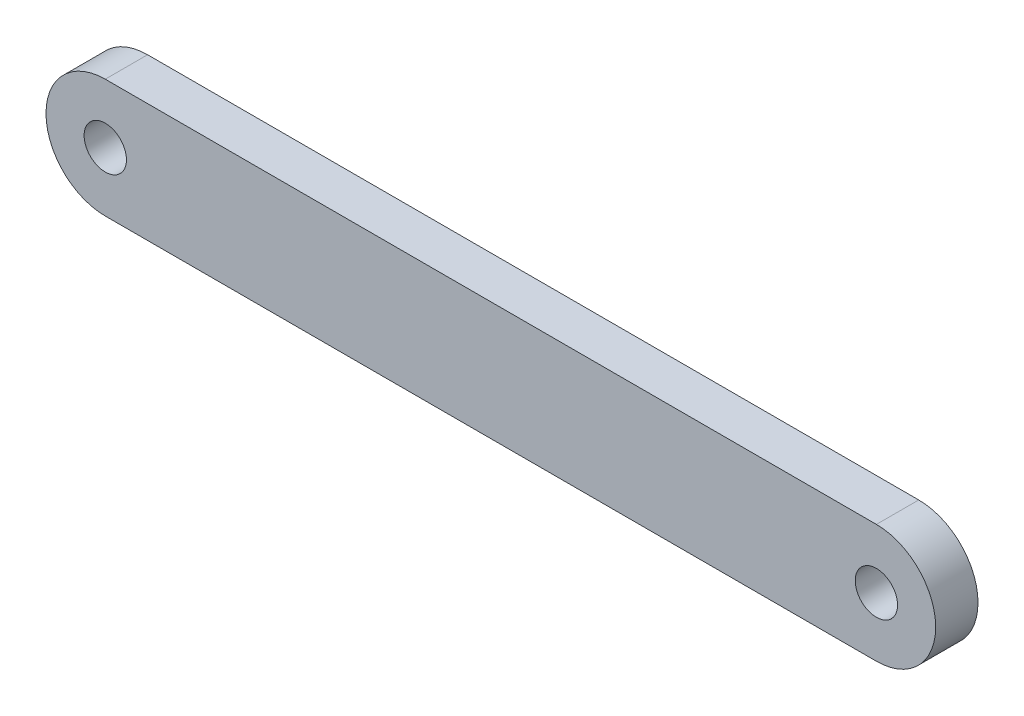
ISO-10303-21;
HEADER;
FILE_DESCRIPTION(('STEP AP214'),'2;1');
FILE_NAME('part.step','',(''),(''),'','','');
FILE_SCHEMA(('AUTOMOTIVE_DESIGN { 1 0 10303 214 1 1 1 1 }'));
ENDSEC;
DATA;
#1=APPLICATION_CONTEXT('core data for automotive mechanical design processes');
#2=APPLICATION_PROTOCOL_DEFINITION('international standard','automotive_design',2000,#1);
#3=PRODUCT_CONTEXT('',#1,'mechanical');
#4=PRODUCT('Part','Part','',(#3));
#5=PRODUCT_RELATED_PRODUCT_CATEGORY('part','',(#4));
#6=PRODUCT_DEFINITION_FORMATION('','',#4);
#7=PRODUCT_DEFINITION_CONTEXT('part definition',#1,'design');
#8=PRODUCT_DEFINITION('design','',#6,#7);
#9=PRODUCT_DEFINITION_SHAPE('','',#8);
#10=(LENGTH_UNIT() NAMED_UNIT(*) SI_UNIT(.MILLI.,.METRE.));
#11=(NAMED_UNIT(*) PLANE_ANGLE_UNIT() SI_UNIT($,.RADIAN.));
#12=(NAMED_UNIT(*) SI_UNIT($,.STERADIAN.) SOLID_ANGLE_UNIT());
#13=UNCERTAINTY_MEASURE_WITH_UNIT(LENGTH_MEASURE(1.E-05),#10,'distance_accuracy_value','');
#14=(GEOMETRIC_REPRESENTATION_CONTEXT(3) GLOBAL_UNCERTAINTY_ASSIGNED_CONTEXT((#13)) GLOBAL_UNIT_ASSIGNED_CONTEXT((#10,
#11,#12)) REPRESENTATION_CONTEXT('',''));
#15=CARTESIAN_POINT('',(0.,0.,0.));
#16=DIRECTION('',(0.,0.,1.));
#17=DIRECTION('',(1.,0.,0.));
#18=AXIS2_PLACEMENT_3D('',#15,#16,#17);
#19=CARTESIAN_POINT('',(66.2273910983488,0.116697774587227,6.35));
#20=DIRECTION('',(0.,0.,-1.));
#21=DIRECTION('',(-1.,0.,0.));
#22=AXIS2_PLACEMENT_3D('',#19,#20,#21);
#23=PLANE('',#22);
#24=CARTESIAN_POINT('',(66.2273910983488,0.116697774587227,6.35));
#25=DIRECTION('',(0.,0.,1.));
#26=DIRECTION('',(-1.,0.,0.));
#27=AXIS2_PLACEMENT_3D('',#24,#25,#26);
#28=CIRCLE('',#27,8.89);
#29=CARTESIAN_POINT('',(66.2273910983488,-8.77330222541277,6.35));
#30=VERTEX_POINT('',#29);
#31=CARTESIAN_POINT('',(66.2273910983488,9.00669777458723,6.35));
#32=VERTEX_POINT('',#31);
#33=EDGE_CURVE('E98',#30,#32,#28,.T.);
#34=ORIENTED_EDGE('',*,*,#33,.T.);
#35=DIRECTION('',(-1.,0.,0.));
#36=VECTOR('',#35,1.);
#37=CARTESIAN_POINT('',(-49.4442089016512,9.00669777458723,6.35));
#38=LINE('',#37,#36);
#39=CARTESIAN_POINT('',(-49.4442089016512,9.00669777458723,6.35));
#40=VERTEX_POINT('',#39);
#41=EDGE_CURVE('E91',#32,#40,#38,.T.);
#42=ORIENTED_EDGE('',*,*,#41,.T.);
#43=CARTESIAN_POINT('',(-49.4442089016512,0.116697774587227,6.35));
#44=DIRECTION('',(0.,0.,1.));
#45=DIRECTION('',(1.,0.,0.));
#46=AXIS2_PLACEMENT_3D('',#43,#44,#45);
#47=CIRCLE('',#46,8.89);
#48=CARTESIAN_POINT('',(-49.4442089016512,-8.77330222541277,6.35));
#49=VERTEX_POINT('',#48);
#50=EDGE_CURVE('E96',#40,#49,#47,.T.);
#51=ORIENTED_EDGE('',*,*,#50,.T.);
#52=DIRECTION('',(1.,0.,0.));
#53=VECTOR('',#52,1.);
#54=CARTESIAN_POINT('',(-49.4442089016512,-8.77330222541277,6.35));
#55=LINE('',#54,#53);
#56=EDGE_CURVE('E64',#49,#30,#55,.T.);
#57=ORIENTED_EDGE('',*,*,#56,.T.);
#58=EDGE_LOOP('',(#34,#42,#51,#57));
#59=FACE_BOUND('',#58,.T.);
#60=CARTESIAN_POINT('',(-49.4442089016512,0.116697774587227,6.35));
#61=DIRECTION('',(0.,0.,1.));
#62=DIRECTION('',(1.,0.,0.));
#63=AXIS2_PLACEMENT_3D('',#60,#61,#62);
#64=CIRCLE('',#63,3.175);
#65=CARTESIAN_POINT('',(-46.2692089016511,0.116697774587227,6.35));
#66=VERTEX_POINT('',#65);
#67=EDGE_CURVE('E119',#66,#66,#64,.T.);
#68=ORIENTED_EDGE('',*,*,#67,.F.);
#69=EDGE_LOOP('',(#68));
#70=FACE_BOUND('',#69,.T.);
#71=CARTESIAN_POINT('',(66.2273910983488,0.116697774587227,6.35));
#72=DIRECTION('',(0.,0.,1.));
#73=DIRECTION('',(1.,0.,0.));
#74=AXIS2_PLACEMENT_3D('',#71,#72,#73);
#75=CIRCLE('',#74,3.175);
#76=CARTESIAN_POINT('',(69.4023910983489,0.116697774587227,6.35));
#77=VERTEX_POINT('',#76);
#78=EDGE_CURVE('E138',#77,#77,#75,.T.);
#79=ORIENTED_EDGE('',*,*,#78,.F.);
#80=EDGE_LOOP('',(#79));
#81=FACE_BOUND('',#80,.T.);
#82=ADVANCED_FACE('F44',(#59,#70,#81),#23,.F.);
#83=CARTESIAN_POINT('',(66.2273910983488,0.116697774587227,0.));
#84=DIRECTION('',(0.,0.,-1.));
#85=DIRECTION('',(-1.,0.,0.));
#86=AXIS2_PLACEMENT_3D('',#83,#84,#85);
#87=PLANE('',#86);
#88=CARTESIAN_POINT('',(-49.4442089016512,0.116697774587227,0.));
#89=DIRECTION('',(0.,0.,1.));
#90=DIRECTION('',(1.,0.,0.));
#91=AXIS2_PLACEMENT_3D('',#88,#89,#90);
#92=CIRCLE('',#91,3.175);
#93=CARTESIAN_POINT('',(-46.2692089016511,0.116697774587227,0.));
#94=VERTEX_POINT('',#93);
#95=EDGE_CURVE('E137',#94,#94,#92,.T.);
#96=ORIENTED_EDGE('',*,*,#95,.T.);
#97=EDGE_LOOP('',(#96));
#98=FACE_BOUND('',#97,.T.);
#99=CARTESIAN_POINT('',(66.2273910983488,0.116697774587227,0.));
#100=DIRECTION('',(0.,0.,1.));
#101=DIRECTION('',(-1.,0.,0.));
#102=AXIS2_PLACEMENT_3D('',#99,#100,#101);
#103=CIRCLE('',#102,8.89);
#104=CARTESIAN_POINT('',(66.2273910983488,-8.77330222541277,0.));
#105=VERTEX_POINT('',#104);
#106=CARTESIAN_POINT('',(66.2273910983488,9.00669777458723,0.));
#107=VERTEX_POINT('',#106);
#108=EDGE_CURVE('E111',#105,#107,#103,.T.);
#109=ORIENTED_EDGE('',*,*,#108,.F.);
#110=DIRECTION('',(1.,0.,0.));
#111=VECTOR('',#110,1.);
#112=CARTESIAN_POINT('',(-49.4442089016512,-8.77330222541277,0.));
#113=LINE('',#112,#111);
#114=CARTESIAN_POINT('',(-49.4442089016512,-8.77330222541277,0.));
#115=VERTEX_POINT('',#114);
#116=EDGE_CURVE('E88',#115,#105,#113,.T.);
#117=ORIENTED_EDGE('',*,*,#116,.F.);
#118=CARTESIAN_POINT('',(-49.4442089016512,0.116697774587227,0.));
#119=DIRECTION('',(0.,0.,1.));
#120=DIRECTION('',(1.,0.,0.));
#121=AXIS2_PLACEMENT_3D('',#118,#119,#120);
#122=CIRCLE('',#121,8.89);
#123=CARTESIAN_POINT('',(-49.4442089016512,9.00669777458723,0.));
#124=VERTEX_POINT('',#123);
#125=EDGE_CURVE('E78',#124,#115,#122,.T.);
#126=ORIENTED_EDGE('',*,*,#125,.F.);
#127=DIRECTION('',(-1.,0.,0.));
#128=VECTOR('',#127,1.);
#129=CARTESIAN_POINT('',(-49.4442089016512,9.00669777458723,0.));
#130=LINE('',#129,#128);
#131=EDGE_CURVE('E103',#107,#124,#130,.T.);
#132=ORIENTED_EDGE('',*,*,#131,.F.);
#133=EDGE_LOOP('',(#109,#117,#126,#132));
#134=FACE_BOUND('',#133,.T.);
#135=CARTESIAN_POINT('',(66.2273910983488,0.116697774587227,0.));
#136=DIRECTION('',(0.,0.,1.));
#137=DIRECTION('',(1.,0.,0.));
#138=AXIS2_PLACEMENT_3D('',#135,#136,#137);
#139=CIRCLE('',#138,3.175);
#140=CARTESIAN_POINT('',(69.4023910983489,0.116697774587227,0.));
#141=VERTEX_POINT('',#140);
#142=EDGE_CURVE('E145',#141,#141,#139,.T.);
#143=ORIENTED_EDGE('',*,*,#142,.T.);
#144=EDGE_LOOP('',(#143));
#145=FACE_BOUND('',#144,.T.);
#146=ADVANCED_FACE('F132',(#98,#134,#145),#87,.T.);
#147=CARTESIAN_POINT('',(66.2273910983488,0.116697774587227,6.35));
#148=DIRECTION('',(0.,0.,-1.));
#149=DIRECTION('',(-1.,0.,0.));
#150=AXIS2_PLACEMENT_3D('',#147,#148,#149);
#151=CYLINDRICAL_SURFACE('',#150,8.89);
#152=ORIENTED_EDGE('',*,*,#108,.T.);
#153=DIRECTION('',(0.,0.,-1.));
#154=VECTOR('',#153,1.);
#155=CARTESIAN_POINT('',(66.2273910983488,9.00669777458723,6.35));
#156=LINE('',#155,#154);
#157=EDGE_CURVE('E11',#32,#107,#156,.T.);
#158=ORIENTED_EDGE('',*,*,#157,.F.);
#159=ORIENTED_EDGE('',*,*,#33,.F.);
#160=DIRECTION('',(0.,0.,-1.));
#161=VECTOR('',#160,1.);
#162=CARTESIAN_POINT('',(66.2273910983488,-8.77330222541277,6.35));
#163=LINE('',#162,#161);
#164=EDGE_CURVE('E109',#30,#105,#163,.T.);
#165=ORIENTED_EDGE('',*,*,#164,.T.);
#166=EDGE_LOOP('',(#152,#158,#159,#165));
#167=FACE_BOUND('',#166,.T.);
#168=ADVANCED_FACE('F50',(#167),#151,.T.);
#169=CARTESIAN_POINT('',(-49.4442089016512,9.00669777458723,6.35));
#170=DIRECTION('',(0.,-1.,0.));
#171=DIRECTION('',(0.,0.,-1.));
#172=AXIS2_PLACEMENT_3D('',#169,#170,#171);
#173=PLANE('',#172);
#174=ORIENTED_EDGE('',*,*,#131,.T.);
#175=DIRECTION('',(0.,0.,-1.));
#176=VECTOR('',#175,1.);
#177=CARTESIAN_POINT('',(-49.4442089016512,9.00669777458723,6.35));
#178=LINE('',#177,#176);
#179=EDGE_CURVE('E54',#40,#124,#178,.T.);
#180=ORIENTED_EDGE('',*,*,#179,.F.);
#181=ORIENTED_EDGE('',*,*,#41,.F.);
#182=ORIENTED_EDGE('',*,*,#157,.T.);
#183=EDGE_LOOP('',(#174,#180,#181,#182));
#184=FACE_BOUND('',#183,.T.);
#185=ADVANCED_FACE('F105',(#184),#173,.F.);
#186=CARTESIAN_POINT('',(-49.4442089016512,0.116697774587227,6.35));
#187=DIRECTION('',(0.,0.,-1.));
#188=DIRECTION('',(-1.,0.,0.));
#189=AXIS2_PLACEMENT_3D('',#186,#187,#188);
#190=CYLINDRICAL_SURFACE('',#189,8.89);
#191=ORIENTED_EDGE('',*,*,#125,.T.);
#192=DIRECTION('',(0.,0.,-1.));
#193=VECTOR('',#192,1.);
#194=CARTESIAN_POINT('',(-49.4442089016512,-8.77330222541277,6.35));
#195=LINE('',#194,#193);
#196=EDGE_CURVE('E104',#49,#115,#195,.T.);
#197=ORIENTED_EDGE('',*,*,#196,.F.);
#198=ORIENTED_EDGE('',*,*,#50,.F.);
#199=ORIENTED_EDGE('',*,*,#179,.T.);
#200=EDGE_LOOP('',(#191,#197,#198,#199));
#201=FACE_BOUND('',#200,.T.);
#202=ADVANCED_FACE('F106',(#201),#190,.T.);
#203=CARTESIAN_POINT('',(-49.4442089016512,-8.77330222541277,6.35));
#204=DIRECTION('',(0.,1.,0.));
#205=DIRECTION('',(0.,0.,1.));
#206=AXIS2_PLACEMENT_3D('',#203,#204,#205);
#207=PLANE('',#206);
#208=ORIENTED_EDGE('',*,*,#116,.T.);
#209=ORIENTED_EDGE('',*,*,#164,.F.);
#210=ORIENTED_EDGE('',*,*,#56,.F.);
#211=ORIENTED_EDGE('',*,*,#196,.T.);
#212=EDGE_LOOP('',(#208,#209,#210,#211));
#213=FACE_BOUND('',#212,.T.);
#214=ADVANCED_FACE('F126',(#213),#207,.F.);
#215=CARTESIAN_POINT('',(-49.4442089016512,0.116697774587227,6.35));
#216=DIRECTION('',(0.,0.,-1.));
#217=DIRECTION('',(-1.,0.,0.));
#218=AXIS2_PLACEMENT_3D('',#215,#216,#217);
#219=CYLINDRICAL_SURFACE('',#218,3.175);
#220=ORIENTED_EDGE('',*,*,#67,.T.);
#221=EDGE_LOOP('',(#220));
#222=FACE_BOUND('',#221,.T.);
#223=ORIENTED_EDGE('',*,*,#95,.F.);
#224=EDGE_LOOP('',(#223));
#225=FACE_BOUND('',#224,.T.);
#226=ADVANCED_FACE('F162',(#222,#225),#219,.F.);
#227=CARTESIAN_POINT('',(66.2273910983488,0.116697774587227,6.35));
#228=DIRECTION('',(0.,0.,-1.));
#229=DIRECTION('',(-1.,0.,0.));
#230=AXIS2_PLACEMENT_3D('',#227,#228,#229);
#231=CYLINDRICAL_SURFACE('',#230,3.175);
#232=ORIENTED_EDGE('',*,*,#78,.T.);
#233=EDGE_LOOP('',(#232));
#234=FACE_BOUND('',#233,.T.);
#235=ORIENTED_EDGE('',*,*,#142,.F.);
#236=EDGE_LOOP('',(#235));
#237=FACE_BOUND('',#236,.T.);
#238=ADVANCED_FACE('F155',(#234,#237),#231,.F.);
#239=CLOSED_SHELL('',(#82,#146,#168,#185,#202,#214,#226,#238));
#240=MANIFOLD_SOLID_BREP('B2',#239);
#241=ADVANCED_BREP_SHAPE_REPRESENTATION('',(#18,#240),#14);
#242=SHAPE_DEFINITION_REPRESENTATION(#9,#241);
ENDSEC;
END-ISO-10303-21;
